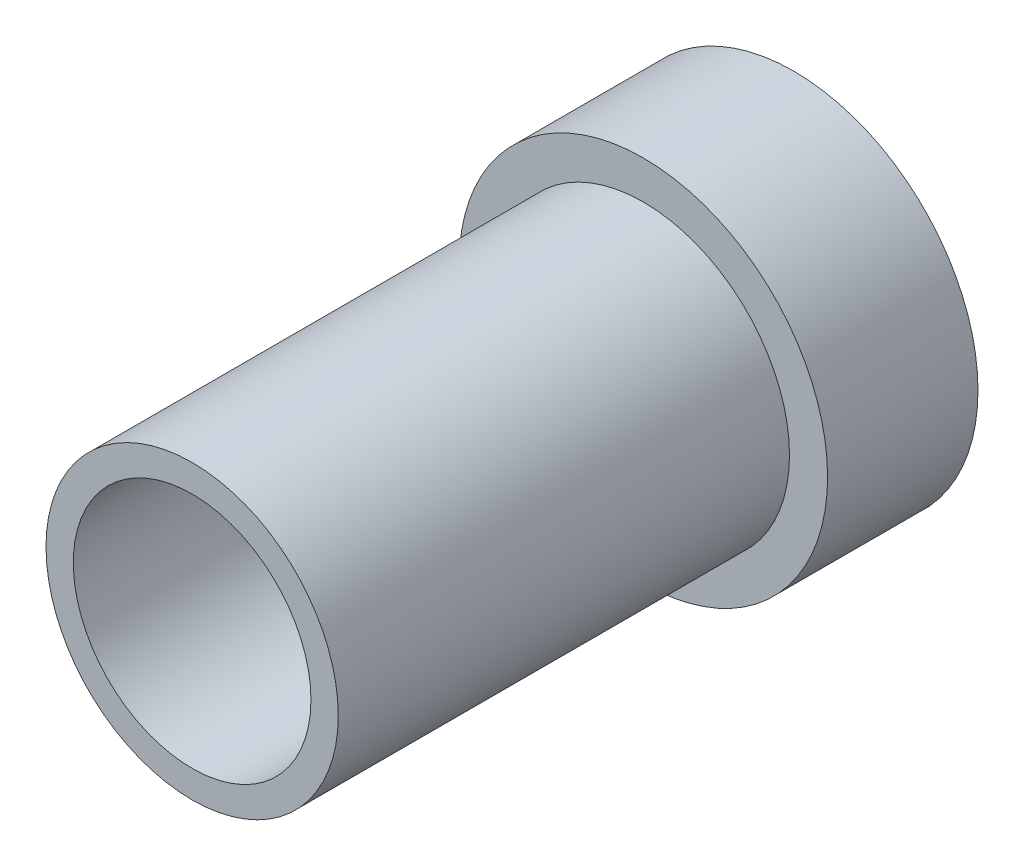
ISO-10303-21;
HEADER;
FILE_DESCRIPTION(('STEP AP214'),'2;1');
FILE_NAME('part.step','',(''),(''),'','','');
FILE_SCHEMA(('AUTOMOTIVE_DESIGN { 1 0 10303 214 1 1 1 1 }'));
ENDSEC;
DATA;
#1=APPLICATION_CONTEXT('core data for automotive mechanical design processes');
#2=APPLICATION_PROTOCOL_DEFINITION('international standard','automotive_design',2000,#1);
#3=PRODUCT_CONTEXT('',#1,'mechanical');
#4=PRODUCT('Part','Part','',(#3));
#5=PRODUCT_RELATED_PRODUCT_CATEGORY('part','',(#4));
#6=PRODUCT_DEFINITION_FORMATION('','',#4);
#7=PRODUCT_DEFINITION_CONTEXT('part definition',#1,'design');
#8=PRODUCT_DEFINITION('design','',#6,#7);
#9=PRODUCT_DEFINITION_SHAPE('','',#8);
#10=(LENGTH_UNIT() NAMED_UNIT(*) SI_UNIT(.MILLI.,.METRE.));
#11=(NAMED_UNIT(*) PLANE_ANGLE_UNIT() SI_UNIT($,.RADIAN.));
#12=(NAMED_UNIT(*) SI_UNIT($,.STERADIAN.) SOLID_ANGLE_UNIT());
#13=UNCERTAINTY_MEASURE_WITH_UNIT(LENGTH_MEASURE(1.E-05),#10,'distance_accuracy_value','');
#14=(GEOMETRIC_REPRESENTATION_CONTEXT(3) GLOBAL_UNCERTAINTY_ASSIGNED_CONTEXT((#13)) GLOBAL_UNIT_ASSIGNED_CONTEXT((#10,
#11,#12)) REPRESENTATION_CONTEXT('',''));
#15=CARTESIAN_POINT('',(0.,0.,0.));
#16=DIRECTION('',(0.,0.,1.));
#17=DIRECTION('',(1.,0.,0.));
#18=AXIS2_PLACEMENT_3D('',#15,#16,#17);
#19=CARTESIAN_POINT('',(0.,0.,20.));
#20=DIRECTION('',(0.,0.,-1.));
#21=DIRECTION('',(-1.,0.,0.));
#22=AXIS2_PLACEMENT_3D('',#19,#20,#21);
#23=CYLINDRICAL_SURFACE('',#22,18.255);
#24=CARTESIAN_POINT('',(0.,0.,20.));
#25=DIRECTION('',(0.,0.,-1.));
#26=DIRECTION('',(1.,0.,0.));
#27=AXIS2_PLACEMENT_3D('',#24,#25,#26);
#28=CIRCLE('',#27,18.255);
#29=CARTESIAN_POINT('',(18.255,0.,20.));
#30=VERTEX_POINT('',#29);
#31=EDGE_CURVE('E10',#30,#30,#28,.T.);
#32=ORIENTED_EDGE('',*,*,#31,.F.);
#33=EDGE_LOOP('',(#32));
#34=FACE_BOUND('',#33,.T.);
#35=CARTESIAN_POINT('',(0.,0.,0.));
#36=DIRECTION('',(0.,0.,-1.));
#37=DIRECTION('',(1.,0.,0.));
#38=AXIS2_PLACEMENT_3D('',#35,#36,#37);
#39=CIRCLE('',#38,18.255);
#40=CARTESIAN_POINT('',(18.255,0.,0.));
#41=VERTEX_POINT('',#40);
#42=EDGE_CURVE('E19',#41,#41,#39,.T.);
#43=ORIENTED_EDGE('',*,*,#42,.T.);
#44=EDGE_LOOP('',(#43));
#45=FACE_BOUND('',#44,.T.);
#46=ADVANCED_FACE('F15',(#34,#45),#23,.F.);
#47=CARTESIAN_POINT('',(0.,0.,20.));
#48=DIRECTION('',(0.,0.,-1.));
#49=DIRECTION('',(-1.,0.,0.));
#50=AXIS2_PLACEMENT_3D('',#47,#48,#49);
#51=CYLINDRICAL_SURFACE('',#50,24.5);
#52=CARTESIAN_POINT('',(0.,0.,20.));
#53=DIRECTION('',(0.,0.,-1.));
#54=DIRECTION('',(1.,0.,0.));
#55=AXIS2_PLACEMENT_3D('',#52,#53,#54);
#56=CIRCLE('',#55,24.5);
#57=CARTESIAN_POINT('',(24.5,0.,20.));
#58=VERTEX_POINT('',#57);
#59=EDGE_CURVE('E23',#58,#58,#56,.T.);
#60=ORIENTED_EDGE('',*,*,#59,.T.);
#61=EDGE_LOOP('',(#60));
#62=FACE_BOUND('',#61,.T.);
#63=CARTESIAN_POINT('',(0.,0.,0.));
#64=DIRECTION('',(0.,0.,-1.));
#65=DIRECTION('',(1.,0.,0.));
#66=AXIS2_PLACEMENT_3D('',#63,#64,#65);
#67=CIRCLE('',#66,24.5);
#68=CARTESIAN_POINT('',(24.5,0.,0.));
#69=VERTEX_POINT('',#68);
#70=EDGE_CURVE('E30',#69,#69,#67,.T.);
#71=ORIENTED_EDGE('',*,*,#70,.F.);
#72=EDGE_LOOP('',(#71));
#73=FACE_BOUND('',#72,.T.);
#74=ADVANCED_FACE('F17',(#62,#73),#51,.T.);
#75=CARTESIAN_POINT('',(0.,0.,20.));
#76=DIRECTION('',(0.,0.,-1.));
#77=DIRECTION('',(-1.,0.,0.));
#78=AXIS2_PLACEMENT_3D('',#75,#76,#77);
#79=PLANE('',#78);
#80=CARTESIAN_POINT('',(0.,0.,20.));
#81=DIRECTION('',(0.,0.,-1.));
#82=DIRECTION('',(1.,0.,0.));
#83=AXIS2_PLACEMENT_3D('',#80,#81,#82);
#84=CIRCLE('',#83,19.4323586969508);
#85=CARTESIAN_POINT('',(19.4323586969508,0.,20.));
#86=VERTEX_POINT('',#85);
#87=EDGE_CURVE('E50',#86,#86,#84,.T.);
#88=ORIENTED_EDGE('',*,*,#87,.T.);
#89=EDGE_LOOP('',(#88));
#90=FACE_BOUND('',#89,.T.);
#91=ORIENTED_EDGE('',*,*,#59,.F.);
#92=EDGE_LOOP('',(#91));
#93=FACE_BOUND('',#92,.T.);
#94=ADVANCED_FACE('F71',(#90,#93),#79,.F.);
#95=CARTESIAN_POINT('',(0.,0.,0.));
#96=DIRECTION('',(0.,0.,-1.));
#97=DIRECTION('',(-1.,0.,0.));
#98=AXIS2_PLACEMENT_3D('',#95,#96,#97);
#99=PLANE('',#98);
#100=ORIENTED_EDGE('',*,*,#42,.F.);
#101=EDGE_LOOP('',(#100));
#102=FACE_BOUND('',#101,.T.);
#103=ORIENTED_EDGE('',*,*,#70,.T.);
#104=EDGE_LOOP('',(#103));
#105=FACE_BOUND('',#104,.T.);
#106=ADVANCED_FACE('F61',(#102,#105),#99,.T.);
#107=CARTESIAN_POINT('',(0.,0.,20.));
#108=DIRECTION('',(0.,0.,-1.));
#109=DIRECTION('',(-1.,0.,0.));
#110=AXIS2_PLACEMENT_3D('',#107,#108,#109);
#111=PLANE('',#110);
#112=CARTESIAN_POINT('',(0.,0.,20.));
#113=DIRECTION('',(0.,0.,-1.));
#114=DIRECTION('',(1.,0.,0.));
#115=AXIS2_PLACEMENT_3D('',#112,#113,#114);
#116=CIRCLE('',#115,15.8);
#117=CARTESIAN_POINT('',(15.8,0.,20.));
#118=VERTEX_POINT('',#117);
#119=EDGE_CURVE('E47',#118,#118,#116,.T.);
#120=ORIENTED_EDGE('',*,*,#119,.F.);
#121=EDGE_LOOP('',(#120));
#122=FACE_BOUND('',#121,.T.);
#123=ORIENTED_EDGE('',*,*,#31,.T.);
#124=EDGE_LOOP('',(#123));
#125=FACE_BOUND('',#124,.T.);
#126=ADVANCED_FACE('F59',(#122,#125),#111,.T.);
#127=CARTESIAN_POINT('',(0.,0.,80.));
#128=DIRECTION('',(0.,0.,-1.));
#129=DIRECTION('',(-1.,0.,0.));
#130=AXIS2_PLACEMENT_3D('',#127,#128,#129);
#131=CYLINDRICAL_SURFACE('',#130,15.8);
#132=CARTESIAN_POINT('',(0.,0.,80.));
#133=DIRECTION('',(0.,0.,-1.));
#134=DIRECTION('',(1.,0.,0.));
#135=AXIS2_PLACEMENT_3D('',#132,#133,#134);
#136=CIRCLE('',#135,15.8);
#137=CARTESIAN_POINT('',(15.8,0.,80.));
#138=VERTEX_POINT('',#137);
#139=EDGE_CURVE('E33',#138,#138,#136,.T.);
#140=ORIENTED_EDGE('',*,*,#139,.F.);
#141=EDGE_LOOP('',(#140));
#142=FACE_BOUND('',#141,.T.);
#143=ORIENTED_EDGE('',*,*,#119,.T.);
#144=EDGE_LOOP('',(#143));
#145=FACE_BOUND('',#144,.T.);
#146=ADVANCED_FACE('F57',(#142,#145),#131,.F.);
#147=CARTESIAN_POINT('',(0.,0.,80.));
#148=DIRECTION('',(0.,0.,-1.));
#149=DIRECTION('',(-1.,0.,0.));
#150=AXIS2_PLACEMENT_3D('',#147,#148,#149);
#151=CYLINDRICAL_SURFACE('',#150,19.4323586969508);
#152=CARTESIAN_POINT('',(0.,0.,80.));
#153=DIRECTION('',(0.,0.,-1.));
#154=DIRECTION('',(1.,0.,0.));
#155=AXIS2_PLACEMENT_3D('',#152,#153,#154);
#156=CIRCLE('',#155,19.4323586969508);
#157=CARTESIAN_POINT('',(19.4323586969508,0.,80.));
#158=VERTEX_POINT('',#157);
#159=EDGE_CURVE('E42',#158,#158,#156,.T.);
#160=ORIENTED_EDGE('',*,*,#159,.T.);
#161=EDGE_LOOP('',(#160));
#162=FACE_BOUND('',#161,.T.);
#163=ORIENTED_EDGE('',*,*,#87,.F.);
#164=EDGE_LOOP('',(#163));
#165=FACE_BOUND('',#164,.T.);
#166=ADVANCED_FACE('F68',(#162,#165),#151,.T.);
#167=CARTESIAN_POINT('',(0.,0.,80.));
#168=DIRECTION('',(0.,0.,-1.));
#169=DIRECTION('',(-1.,0.,0.));
#170=AXIS2_PLACEMENT_3D('',#167,#168,#169);
#171=PLANE('',#170);
#172=ORIENTED_EDGE('',*,*,#139,.T.);
#173=EDGE_LOOP('',(#172));
#174=FACE_BOUND('',#173,.T.);
#175=ORIENTED_EDGE('',*,*,#159,.F.);
#176=EDGE_LOOP('',(#175));
#177=FACE_BOUND('',#176,.T.);
#178=ADVANCED_FACE('F87',(#174,#177),#171,.F.);
#179=CLOSED_SHELL('',(#46,#74,#94,#106,#126,#146,#166,#178));
#180=MANIFOLD_SOLID_BREP('B1',#179);
#181=ADVANCED_BREP_SHAPE_REPRESENTATION('',(#18,#180),#14);
#182=SHAPE_DEFINITION_REPRESENTATION(#9,#181);
ENDSEC;
END-ISO-10303-21;
